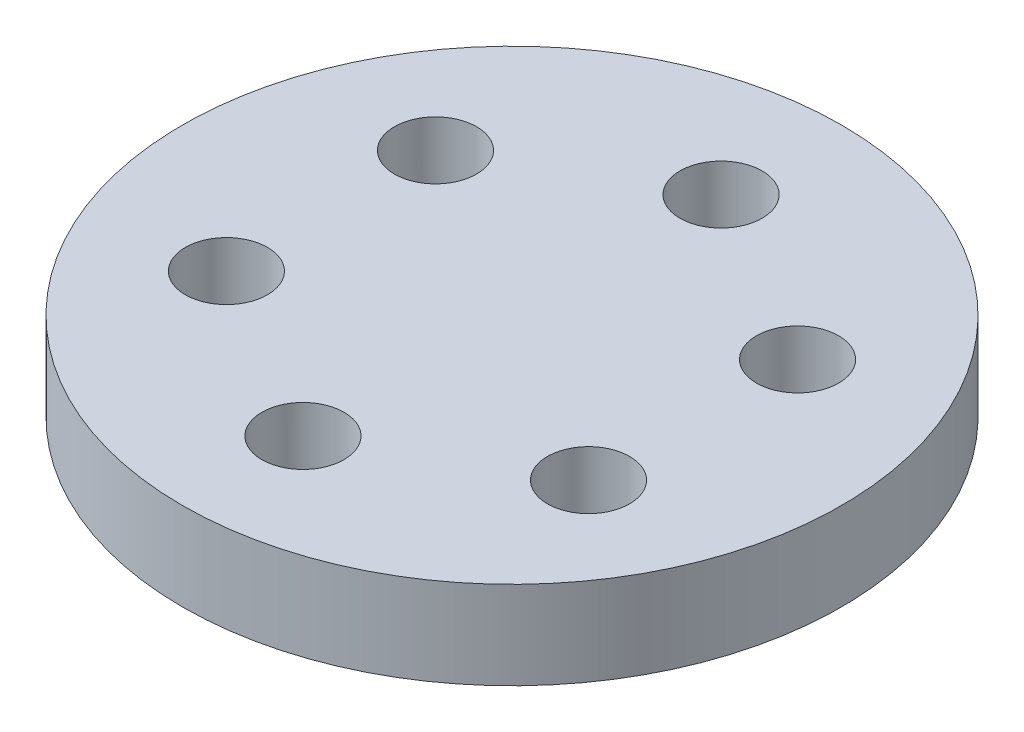
ISO-10303-21;
HEADER;
FILE_DESCRIPTION(('STEP AP214'),'2;1');
FILE_NAME('part.step','',(''),(''),'','','');
FILE_SCHEMA(('AUTOMOTIVE_DESIGN { 1 0 10303 214 1 1 1 1 }'));
ENDSEC;
DATA;
#1=APPLICATION_CONTEXT('core data for automotive mechanical design processes');
#2=APPLICATION_PROTOCOL_DEFINITION('international standard','automotive_design',2000,#1);
#3=PRODUCT_CONTEXT('',#1,'mechanical');
#4=PRODUCT('Part','Part','',(#3));
#5=PRODUCT_RELATED_PRODUCT_CATEGORY('part','',(#4));
#6=PRODUCT_DEFINITION_FORMATION('','',#4);
#7=PRODUCT_DEFINITION_CONTEXT('part definition',#1,'design');
#8=PRODUCT_DEFINITION('design','',#6,#7);
#9=PRODUCT_DEFINITION_SHAPE('','',#8);
#10=(LENGTH_UNIT() NAMED_UNIT(*) SI_UNIT(.MILLI.,.METRE.));
#11=(NAMED_UNIT(*) PLANE_ANGLE_UNIT() SI_UNIT($,.RADIAN.));
#12=(NAMED_UNIT(*) SI_UNIT($,.STERADIAN.) SOLID_ANGLE_UNIT());
#13=UNCERTAINTY_MEASURE_WITH_UNIT(LENGTH_MEASURE(1.E-05),#10,'distance_accuracy_value','');
#14=(GEOMETRIC_REPRESENTATION_CONTEXT(3) GLOBAL_UNCERTAINTY_ASSIGNED_CONTEXT((#13)) GLOBAL_UNIT_ASSIGNED_CONTEXT((#10,
#11,#12)) REPRESENTATION_CONTEXT('',''));
#15=CARTESIAN_POINT('',(0.,0.,0.));
#16=DIRECTION('',(0.,0.,1.));
#17=DIRECTION('',(1.,0.,0.));
#18=AXIS2_PLACEMENT_3D('',#15,#16,#17);
#19=CARTESIAN_POINT('',(0.,10.16,0.));
#20=DIRECTION('',(0.,-1.,0.));
#21=DIRECTION('',(0.,0.,-1.));
#22=AXIS2_PLACEMENT_3D('',#19,#20,#21);
#23=CYLINDRICAL_SURFACE('',#22,38.1);
#24=CARTESIAN_POINT('',(0.,10.16,0.));
#25=DIRECTION('',(0.,1.,0.));
#26=DIRECTION('',(0.,0.,1.));
#27=AXIS2_PLACEMENT_3D('',#24,#25,#26);
#28=CIRCLE('',#27,38.1);
#29=CARTESIAN_POINT('',(0.,10.16,38.1));
#30=VERTEX_POINT('',#29);
#31=EDGE_CURVE('E10',#30,#30,#28,.T.);
#32=ORIENTED_EDGE('',*,*,#31,.F.);
#33=EDGE_LOOP('',(#32));
#34=FACE_BOUND('',#33,.T.);
#35=CARTESIAN_POINT('',(0.,0.,0.));
#36=DIRECTION('',(0.,1.,0.));
#37=DIRECTION('',(0.,0.,1.));
#38=AXIS2_PLACEMENT_3D('',#35,#36,#37);
#39=CIRCLE('',#38,38.1);
#40=CARTESIAN_POINT('',(0.,0.,38.1));
#41=VERTEX_POINT('',#40);
#42=EDGE_CURVE('E49',#41,#41,#39,.T.);
#43=ORIENTED_EDGE('',*,*,#42,.T.);
#44=EDGE_LOOP('',(#43));
#45=FACE_BOUND('',#44,.T.);
#46=ADVANCED_FACE('F41',(#34,#45),#23,.T.);
#47=CARTESIAN_POINT('',(0.,10.16,0.));
#48=DIRECTION('',(0.,1.,0.));
#49=DIRECTION('',(0.,0.,1.));
#50=AXIS2_PLACEMENT_3D('',#47,#48,#49);
#51=PLANE('',#50);
#52=CARTESIAN_POINT('',(20.9308028785496,10.16,-12.0844046762859));
#53=DIRECTION('',(0.,1.,0.));
#54=DIRECTION('',(-0.866025403784433,0.,0.50000000000001));
#55=AXIS2_PLACEMENT_3D('',#52,#53,#54);
#56=CIRCLE('',#55,4.74923553003875);
#57=CARTESIAN_POINT('',(16.8178442609804,10.16,-9.70978691126651));
#58=VERTEX_POINT('',#57);
#59=EDGE_CURVE('E156',#58,#58,#56,.T.);
#60=ORIENTED_EDGE('',*,*,#59,.F.);
#61=EDGE_LOOP('',(#60));
#62=FACE_BOUND('',#61,.T.);
#63=CARTESIAN_POINT('',(20.9308028785499,10.16,12.0844046762855));
#64=DIRECTION('',(0.,1.,0.));
#65=DIRECTION('',(-0.866025403784443,0.,-0.499999999999992));
#66=AXIS2_PLACEMENT_3D('',#63,#64,#65);
#67=CIRCLE('',#66,4.74923553003875);
#68=CARTESIAN_POINT('',(16.8178442609806,10.16,9.70978691126616));
#69=VERTEX_POINT('',#68);
#70=EDGE_CURVE('E150',#69,#69,#67,.T.);
#71=ORIENTED_EDGE('',*,*,#70,.F.);
#72=EDGE_LOOP('',(#71));
#73=FACE_BOUND('',#72,.T.);
#74=CARTESIAN_POINT('',(0.,10.16,24.1688093525714));
#75=DIRECTION('',(0.,1.,0.));
#76=DIRECTION('',(0.,0.,-1.));
#77=AXIS2_PLACEMENT_3D('',#74,#75,#76);
#78=CIRCLE('',#77,4.74923553003875);
#79=CARTESIAN_POINT('',(0.,10.16,19.4195738225326));
#80=VERTEX_POINT('',#79);
#81=EDGE_CURVE('E144',#80,#80,#78,.T.);
#82=ORIENTED_EDGE('',*,*,#81,.F.);
#83=EDGE_LOOP('',(#82));
#84=FACE_BOUND('',#83,.T.);
#85=CARTESIAN_POINT('',(-20.9308028785497,10.16,12.0844046762858));
#86=DIRECTION('',(0.,1.,0.));
#87=DIRECTION('',(0.866025403784436,0.,-0.500000000000004));
#88=AXIS2_PLACEMENT_3D('',#85,#86,#87);
#89=CIRCLE('',#88,4.74923553003875);
#90=CARTESIAN_POINT('',(-16.8178442609805,10.16,9.70978691126639));
#91=VERTEX_POINT('',#90);
#92=EDGE_CURVE('E131',#91,#91,#89,.T.);
#93=ORIENTED_EDGE('',*,*,#92,.F.);
#94=EDGE_LOOP('',(#93));
#95=FACE_BOUND('',#94,.T.);
#96=CARTESIAN_POINT('',(-20.9308028785498,10.16,-12.0844046762856));
#97=DIRECTION('',(0.,1.,0.));
#98=DIRECTION('',(0.86602540378444,0.,0.499999999999998));
#99=AXIS2_PLACEMENT_3D('',#96,#97,#98);
#100=CIRCLE('',#99,4.74923553003875);
#101=CARTESIAN_POINT('',(-16.8178442609806,10.16,-9.70978691126628));
#102=VERTEX_POINT('',#101);
#103=EDGE_CURVE('E69',#102,#102,#100,.T.);
#104=ORIENTED_EDGE('',*,*,#103,.F.);
#105=EDGE_LOOP('',(#104));
#106=FACE_BOUND('',#105,.T.);
#107=CARTESIAN_POINT('',(0.,10.16,-24.1688093525714));
#108=DIRECTION('',(0.,1.,0.));
#109=DIRECTION('',(0.,0.,1.));
#110=AXIS2_PLACEMENT_3D('',#107,#108,#109);
#111=CIRCLE('',#110,4.74923553003875);
#112=CARTESIAN_POINT('',(0.,10.16,-19.4195738225326));
#113=VERTEX_POINT('',#112);
#114=EDGE_CURVE('E58',#113,#113,#111,.T.);
#115=ORIENTED_EDGE('',*,*,#114,.F.);
#116=EDGE_LOOP('',(#115));
#117=FACE_BOUND('',#116,.T.);
#118=ORIENTED_EDGE('',*,*,#31,.T.);
#119=EDGE_LOOP('',(#118));
#120=FACE_BOUND('',#119,.T.);
#121=ADVANCED_FACE('F92',(#62,#73,#84,#95,#106,#117,#120),#51,.T.);
#122=CARTESIAN_POINT('',(0.,0.,0.));
#123=DIRECTION('',(0.,1.,0.));
#124=DIRECTION('',(0.,0.,1.));
#125=AXIS2_PLACEMENT_3D('',#122,#123,#124);
#126=PLANE('',#125);
#127=CARTESIAN_POINT('',(20.9308028785496,0.,-12.0844046762859));
#128=DIRECTION('',(0.,1.,0.));
#129=DIRECTION('',(0.,0.,1.));
#130=AXIS2_PLACEMENT_3D('',#127,#128,#129);
#131=CIRCLE('',#130,4.74923553003875);
#132=CARTESIAN_POINT('',(20.9308028785496,0.,-7.33516914624718));
#133=VERTEX_POINT('',#132);
#134=EDGE_CURVE('E44',#133,#133,#131,.T.);
#135=ORIENTED_EDGE('',*,*,#134,.T.);
#136=EDGE_LOOP('',(#135));
#137=FACE_BOUND('',#136,.T.);
#138=CARTESIAN_POINT('',(20.9308028785499,0.,12.0844046762855));
#139=DIRECTION('',(0.,1.,0.));
#140=DIRECTION('',(0.,0.,1.));
#141=AXIS2_PLACEMENT_3D('',#138,#139,#140);
#142=CIRCLE('',#141,4.74923553003875);
#143=CARTESIAN_POINT('',(20.9308028785499,0.,16.8336402063243));
#144=VERTEX_POINT('',#143);
#145=EDGE_CURVE('E76',#144,#144,#142,.T.);
#146=ORIENTED_EDGE('',*,*,#145,.T.);
#147=EDGE_LOOP('',(#146));
#148=FACE_BOUND('',#147,.T.);
#149=CARTESIAN_POINT('',(0.,0.,24.1688093525714));
#150=DIRECTION('',(0.,1.,0.));
#151=DIRECTION('',(0.,0.,1.));
#152=AXIS2_PLACEMENT_3D('',#149,#150,#151);
#153=CIRCLE('',#152,4.74923553003875);
#154=CARTESIAN_POINT('',(0.,0.,28.9180448826101));
#155=VERTEX_POINT('',#154);
#156=EDGE_CURVE('E73',#155,#155,#153,.T.);
#157=ORIENTED_EDGE('',*,*,#156,.T.);
#158=EDGE_LOOP('',(#157));
#159=FACE_BOUND('',#158,.T.);
#160=CARTESIAN_POINT('',(-20.9308028785497,0.,12.0844046762858));
#161=DIRECTION('',(0.,1.,0.));
#162=DIRECTION('',(0.,0.,1.));
#163=AXIS2_PLACEMENT_3D('',#160,#161,#162);
#164=CIRCLE('',#163,4.74923553003875);
#165=CARTESIAN_POINT('',(-20.9308028785497,0.,16.8336402063245));
#166=VERTEX_POINT('',#165);
#167=EDGE_CURVE('E68',#166,#166,#164,.T.);
#168=ORIENTED_EDGE('',*,*,#167,.T.);
#169=EDGE_LOOP('',(#168));
#170=FACE_BOUND('',#169,.T.);
#171=CARTESIAN_POINT('',(-20.9308028785498,0.,-12.0844046762856));
#172=DIRECTION('',(0.,1.,0.));
#173=DIRECTION('',(0.,0.,1.));
#174=AXIS2_PLACEMENT_3D('',#171,#172,#173);
#175=CIRCLE('',#174,4.74923553003875);
#176=CARTESIAN_POINT('',(-20.9308028785498,0.,-7.33516914624689));
#177=VERTEX_POINT('',#176);
#178=EDGE_CURVE('E64',#177,#177,#175,.T.);
#179=ORIENTED_EDGE('',*,*,#178,.T.);
#180=EDGE_LOOP('',(#179));
#181=FACE_BOUND('',#180,.T.);
#182=CARTESIAN_POINT('',(0.,0.,-24.1688093525714));
#183=DIRECTION('',(0.,1.,0.));
#184=DIRECTION('',(0.,0.,1.));
#185=AXIS2_PLACEMENT_3D('',#182,#183,#184);
#186=CIRCLE('',#185,4.74923553003875);
#187=CARTESIAN_POINT('',(0.,0.,-19.4195738225326));
#188=VERTEX_POINT('',#187);
#189=EDGE_CURVE('E55',#188,#188,#186,.T.);
#190=ORIENTED_EDGE('',*,*,#189,.T.);
#191=EDGE_LOOP('',(#190));
#192=FACE_BOUND('',#191,.T.);
#193=ORIENTED_EDGE('',*,*,#42,.F.);
#194=EDGE_LOOP('',(#193));
#195=FACE_BOUND('',#194,.T.);
#196=ADVANCED_FACE('F94',(#137,#148,#159,#170,#181,#192,#195),#126,.F.);
#197=CARTESIAN_POINT('',(0.,-15.24,-24.1688093525714));
#198=DIRECTION('',(0.,1.,0.));
#199=DIRECTION('',(0.,0.,1.));
#200=AXIS2_PLACEMENT_3D('',#197,#198,#199);
#201=CYLINDRICAL_SURFACE('',#200,4.74923553003875);
#202=ORIENTED_EDGE('',*,*,#114,.T.);
#203=EDGE_LOOP('',(#202));
#204=FACE_BOUND('',#203,.T.);
#205=ORIENTED_EDGE('',*,*,#189,.F.);
#206=EDGE_LOOP('',(#205));
#207=FACE_BOUND('',#206,.T.);
#208=ADVANCED_FACE('F89',(#204,#207),#201,.F.);
#209=CARTESIAN_POINT('',(-20.9308028785498,-15.24,-12.0844046762856));
#210=DIRECTION('',(0.,1.,0.));
#211=DIRECTION('',(0.,0.,1.));
#212=AXIS2_PLACEMENT_3D('',#209,#210,#211);
#213=CYLINDRICAL_SURFACE('',#212,4.74923553003875);
#214=ORIENTED_EDGE('',*,*,#103,.T.);
#215=EDGE_LOOP('',(#214));
#216=FACE_BOUND('',#215,.T.);
#217=ORIENTED_EDGE('',*,*,#178,.F.);
#218=EDGE_LOOP('',(#217));
#219=FACE_BOUND('',#218,.T.);
#220=ADVANCED_FACE('F107',(#216,#219),#213,.F.);
#221=CARTESIAN_POINT('',(-20.9308028785497,-15.24,12.0844046762858));
#222=DIRECTION('',(0.,1.,0.));
#223=DIRECTION('',(0.,0.,1.));
#224=AXIS2_PLACEMENT_3D('',#221,#222,#223);
#225=CYLINDRICAL_SURFACE('',#224,4.74923553003875);
#226=ORIENTED_EDGE('',*,*,#92,.T.);
#227=EDGE_LOOP('',(#226));
#228=FACE_BOUND('',#227,.T.);
#229=ORIENTED_EDGE('',*,*,#167,.F.);
#230=EDGE_LOOP('',(#229));
#231=FACE_BOUND('',#230,.T.);
#232=ADVANCED_FACE('F110',(#228,#231),#225,.F.);
#233=CARTESIAN_POINT('',(0.,-15.24,24.1688093525714));
#234=DIRECTION('',(0.,1.,0.));
#235=DIRECTION('',(0.,0.,1.));
#236=AXIS2_PLACEMENT_3D('',#233,#234,#235);
#237=CYLINDRICAL_SURFACE('',#236,4.74923553003875);
#238=ORIENTED_EDGE('',*,*,#81,.T.);
#239=EDGE_LOOP('',(#238));
#240=FACE_BOUND('',#239,.T.);
#241=ORIENTED_EDGE('',*,*,#156,.F.);
#242=EDGE_LOOP('',(#241));
#243=FACE_BOUND('',#242,.T.);
#244=ADVANCED_FACE('F119',(#240,#243),#237,.F.);
#245=CARTESIAN_POINT('',(20.9308028785499,-15.24,12.0844046762855));
#246=DIRECTION('',(0.,1.,0.));
#247=DIRECTION('',(0.,0.,1.));
#248=AXIS2_PLACEMENT_3D('',#245,#246,#247);
#249=CYLINDRICAL_SURFACE('',#248,4.74923553003875);
#250=ORIENTED_EDGE('',*,*,#70,.T.);
#251=EDGE_LOOP('',(#250));
#252=FACE_BOUND('',#251,.T.);
#253=ORIENTED_EDGE('',*,*,#145,.F.);
#254=EDGE_LOOP('',(#253));
#255=FACE_BOUND('',#254,.T.);
#256=ADVANCED_FACE('F115',(#252,#255),#249,.F.);
#257=CARTESIAN_POINT('',(20.9308028785496,-15.24,-12.0844046762859));
#258=DIRECTION('',(0.,1.,0.));
#259=DIRECTION('',(0.,0.,1.));
#260=AXIS2_PLACEMENT_3D('',#257,#258,#259);
#261=CYLINDRICAL_SURFACE('',#260,4.74923553003875);
#262=ORIENTED_EDGE('',*,*,#59,.T.);
#263=EDGE_LOOP('',(#262));
#264=FACE_BOUND('',#263,.T.);
#265=ORIENTED_EDGE('',*,*,#134,.F.);
#266=EDGE_LOOP('',(#265));
#267=FACE_BOUND('',#266,.T.);
#268=ADVANCED_FACE('F112',(#264,#267),#261,.F.);
#269=CLOSED_SHELL('',(#46,#121,#196,#208,#220,#232,#244,#256,#268));
#270=MANIFOLD_SOLID_BREP('B2',#269);
#271=ADVANCED_BREP_SHAPE_REPRESENTATION('',(#18,#270),#14);
#272=SHAPE_DEFINITION_REPRESENTATION(#9,#271);
ENDSEC;
END-ISO-10303-21;
